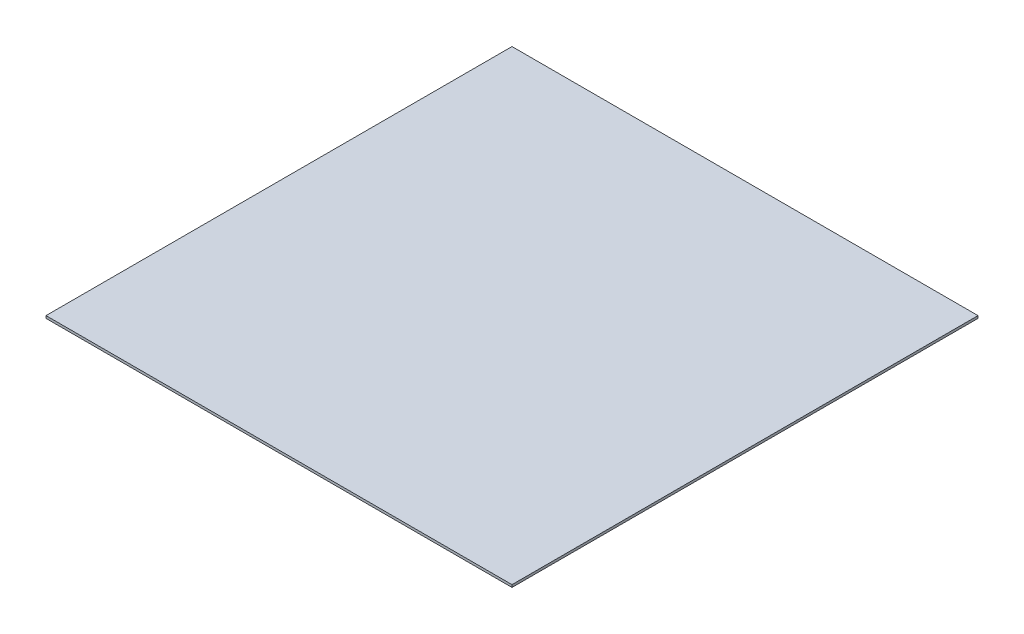
ISO-10303-21;
HEADER;
FILE_DESCRIPTION(('STEP AP214'),'2;1');
FILE_NAME('part.step','',(''),(''),'','','');
FILE_SCHEMA(('AUTOMOTIVE_DESIGN { 1 0 10303 214 1 1 1 1 }'));
ENDSEC;
DATA;
#1=APPLICATION_CONTEXT('core data for automotive mechanical design processes');
#2=APPLICATION_PROTOCOL_DEFINITION('international standard','automotive_design',2000,#1);
#3=PRODUCT_CONTEXT('',#1,'mechanical');
#4=PRODUCT('Part','Part','',(#3));
#5=PRODUCT_RELATED_PRODUCT_CATEGORY('part','',(#4));
#6=PRODUCT_DEFINITION_FORMATION('','',#4);
#7=PRODUCT_DEFINITION_CONTEXT('part definition',#1,'design');
#8=PRODUCT_DEFINITION('design','',#6,#7);
#9=PRODUCT_DEFINITION_SHAPE('','',#8);
#10=(LENGTH_UNIT() NAMED_UNIT(*) SI_UNIT(.MILLI.,.METRE.));
#11=(NAMED_UNIT(*) PLANE_ANGLE_UNIT() SI_UNIT($,.RADIAN.));
#12=(NAMED_UNIT(*) SI_UNIT($,.STERADIAN.) SOLID_ANGLE_UNIT());
#13=UNCERTAINTY_MEASURE_WITH_UNIT(LENGTH_MEASURE(1.E-05),#10,'distance_accuracy_value','');
#14=(GEOMETRIC_REPRESENTATION_CONTEXT(3) GLOBAL_UNCERTAINTY_ASSIGNED_CONTEXT((#13)) GLOBAL_UNIT_ASSIGNED_CONTEXT((#10,
#11,#12)) REPRESENTATION_CONTEXT('',''));
#15=CARTESIAN_POINT('',(0.,0.,0.));
#16=DIRECTION('',(0.,0.,1.));
#17=DIRECTION('',(1.,0.,0.));
#18=AXIS2_PLACEMENT_3D('',#15,#16,#17);
#19=CARTESIAN_POINT('',(38.1,0.4,38.1));
#20=DIRECTION('',(-1.,0.,0.));
#21=DIRECTION('',(0.,0.,1.));
#22=AXIS2_PLACEMENT_3D('',#19,#20,#21);
#23=PLANE('',#22);
#24=DIRECTION('',(0.,0.,-1.));
#25=VECTOR('',#24,1.);
#26=CARTESIAN_POINT('',(38.1,0.,38.1));
#27=LINE('',#26,#25);
#28=CARTESIAN_POINT('',(38.1,0.,38.1));
#29=VERTEX_POINT('',#28);
#30=CARTESIAN_POINT('',(38.1,0.,-38.1));
#31=VERTEX_POINT('',#30);
#32=EDGE_CURVE('E115',#29,#31,#27,.T.);
#33=ORIENTED_EDGE('',*,*,#32,.T.);
#34=DIRECTION('',(0.,-1.,0.));
#35=VECTOR('',#34,1.);
#36=CARTESIAN_POINT('',(38.1,0.4,-38.1));
#37=LINE('',#36,#35);
#38=CARTESIAN_POINT('',(38.1,0.4,-38.1));
#39=VERTEX_POINT('',#38);
#40=EDGE_CURVE('E11',#39,#31,#37,.T.);
#41=ORIENTED_EDGE('',*,*,#40,.F.);
#42=DIRECTION('',(0.,0.,-1.));
#43=VECTOR('',#42,1.);
#44=CARTESIAN_POINT('',(38.1,0.4,38.1));
#45=LINE('',#44,#43);
#46=CARTESIAN_POINT('',(38.1,0.4,38.1));
#47=VERTEX_POINT('',#46);
#48=EDGE_CURVE('E99',#47,#39,#45,.T.);
#49=ORIENTED_EDGE('',*,*,#48,.F.);
#50=DIRECTION('',(0.,-1.,0.));
#51=VECTOR('',#50,1.);
#52=CARTESIAN_POINT('',(38.1,0.4,38.1));
#53=LINE('',#52,#51);
#54=EDGE_CURVE('E111',#47,#29,#53,.T.);
#55=ORIENTED_EDGE('',*,*,#54,.T.);
#56=EDGE_LOOP('',(#33,#41,#49,#55));
#57=FACE_BOUND('',#56,.T.);
#58=ADVANCED_FACE('F47',(#57),#23,.F.);
#59=CARTESIAN_POINT('',(-38.1,0.4,-38.1));
#60=DIRECTION('',(0.,0.,1.));
#61=DIRECTION('',(1.,0.,0.));
#62=AXIS2_PLACEMENT_3D('',#59,#60,#61);
#63=PLANE('',#62);
#64=DIRECTION('',(-1.,0.,0.));
#65=VECTOR('',#64,1.);
#66=CARTESIAN_POINT('',(-38.1,0.,-38.1));
#67=LINE('',#66,#65);
#68=CARTESIAN_POINT('',(-38.1,0.,-38.1));
#69=VERTEX_POINT('',#68);
#70=EDGE_CURVE('E104',#31,#69,#67,.T.);
#71=ORIENTED_EDGE('',*,*,#70,.T.);
#72=DIRECTION('',(0.,-1.,0.));
#73=VECTOR('',#72,1.);
#74=CARTESIAN_POINT('',(-38.1,0.4,-38.1));
#75=LINE('',#74,#73);
#76=CARTESIAN_POINT('',(-38.1,0.4,-38.1));
#77=VERTEX_POINT('',#76);
#78=EDGE_CURVE('E56',#77,#69,#75,.T.);
#79=ORIENTED_EDGE('',*,*,#78,.F.);
#80=DIRECTION('',(-1.,0.,0.));
#81=VECTOR('',#80,1.);
#82=CARTESIAN_POINT('',(-38.1,0.4,-38.1));
#83=LINE('',#82,#81);
#84=EDGE_CURVE('E94',#39,#77,#83,.T.);
#85=ORIENTED_EDGE('',*,*,#84,.F.);
#86=ORIENTED_EDGE('',*,*,#40,.T.);
#87=EDGE_LOOP('',(#71,#79,#85,#86));
#88=FACE_BOUND('',#87,.T.);
#89=ADVANCED_FACE('F103',(#88),#63,.F.);
#90=CARTESIAN_POINT('',(-38.1,0.4,38.1));
#91=DIRECTION('',(1.,0.,0.));
#92=DIRECTION('',(0.,0.,-1.));
#93=AXIS2_PLACEMENT_3D('',#90,#91,#92);
#94=PLANE('',#93);
#95=DIRECTION('',(0.,0.,1.));
#96=VECTOR('',#95,1.);
#97=CARTESIAN_POINT('',(-38.1,0.,38.1));
#98=LINE('',#97,#96);
#99=CARTESIAN_POINT('',(-38.1,0.,38.1));
#100=VERTEX_POINT('',#99);
#101=EDGE_CURVE('E81',#69,#100,#98,.T.);
#102=ORIENTED_EDGE('',*,*,#101,.T.);
#103=DIRECTION('',(0.,-1.,0.));
#104=VECTOR('',#103,1.);
#105=CARTESIAN_POINT('',(-38.1,0.4,38.1));
#106=LINE('',#105,#104);
#107=CARTESIAN_POINT('',(-38.1,0.4,38.1));
#108=VERTEX_POINT('',#107);
#109=EDGE_CURVE('E106',#108,#100,#106,.T.);
#110=ORIENTED_EDGE('',*,*,#109,.F.);
#111=DIRECTION('',(0.,0.,1.));
#112=VECTOR('',#111,1.);
#113=CARTESIAN_POINT('',(-38.1,0.4,38.1));
#114=LINE('',#113,#112);
#115=EDGE_CURVE('E97',#77,#108,#114,.T.);
#116=ORIENTED_EDGE('',*,*,#115,.F.);
#117=ORIENTED_EDGE('',*,*,#78,.T.);
#118=EDGE_LOOP('',(#102,#110,#116,#117));
#119=FACE_BOUND('',#118,.T.);
#120=ADVANCED_FACE('F107',(#119),#94,.F.);
#121=CARTESIAN_POINT('',(-38.1,0.4,38.1));
#122=DIRECTION('',(0.,0.,-1.));
#123=DIRECTION('',(-1.,0.,0.));
#124=AXIS2_PLACEMENT_3D('',#121,#122,#123);
#125=PLANE('',#124);
#126=DIRECTION('',(1.,0.,0.));
#127=VECTOR('',#126,1.);
#128=CARTESIAN_POINT('',(-38.1,0.,38.1));
#129=LINE('',#128,#127);
#130=EDGE_CURVE('E87',#100,#29,#129,.T.);
#131=ORIENTED_EDGE('',*,*,#130,.T.);
#132=ORIENTED_EDGE('',*,*,#54,.F.);
#133=DIRECTION('',(1.,0.,0.));
#134=VECTOR('',#133,1.);
#135=CARTESIAN_POINT('',(-38.1,0.4,38.1));
#136=LINE('',#135,#134);
#137=EDGE_CURVE('E64',#108,#47,#136,.T.);
#138=ORIENTED_EDGE('',*,*,#137,.F.);
#139=ORIENTED_EDGE('',*,*,#109,.T.);
#140=EDGE_LOOP('',(#131,#132,#138,#139));
#141=FACE_BOUND('',#140,.T.);
#142=ADVANCED_FACE('F128',(#141),#125,.F.);
#143=CARTESIAN_POINT('',(0.,0.4,0.));
#144=DIRECTION('',(0.,-1.,0.));
#145=DIRECTION('',(0.,0.,-1.));
#146=AXIS2_PLACEMENT_3D('',#143,#144,#145);
#147=PLANE('',#146);
#148=ORIENTED_EDGE('',*,*,#48,.T.);
#149=ORIENTED_EDGE('',*,*,#84,.T.);
#150=ORIENTED_EDGE('',*,*,#115,.T.);
#151=ORIENTED_EDGE('',*,*,#137,.T.);
#152=EDGE_LOOP('',(#148,#149,#150,#151));
#153=FACE_BOUND('',#152,.T.);
#154=ADVANCED_FACE('F95',(#153),#147,.F.);
#155=CARTESIAN_POINT('',(0.,0.,0.));
#156=DIRECTION('',(0.,-1.,0.));
#157=DIRECTION('',(0.,0.,-1.));
#158=AXIS2_PLACEMENT_3D('',#155,#156,#157);
#159=PLANE('',#158);
#160=ORIENTED_EDGE('',*,*,#32,.F.);
#161=ORIENTED_EDGE('',*,*,#130,.F.);
#162=ORIENTED_EDGE('',*,*,#101,.F.);
#163=ORIENTED_EDGE('',*,*,#70,.F.);
#164=EDGE_LOOP('',(#160,#161,#162,#163));
#165=FACE_BOUND('',#164,.T.);
#166=ADVANCED_FACE('F131',(#165),#159,.T.);
#167=CLOSED_SHELL('',(#58,#89,#120,#142,#154,#166));
#168=MANIFOLD_SOLID_BREP('B2',#167);
#169=ADVANCED_BREP_SHAPE_REPRESENTATION('',(#18,#168),#14);
#170=SHAPE_DEFINITION_REPRESENTATION(#9,#169);
ENDSEC;
END-ISO-10303-21;
